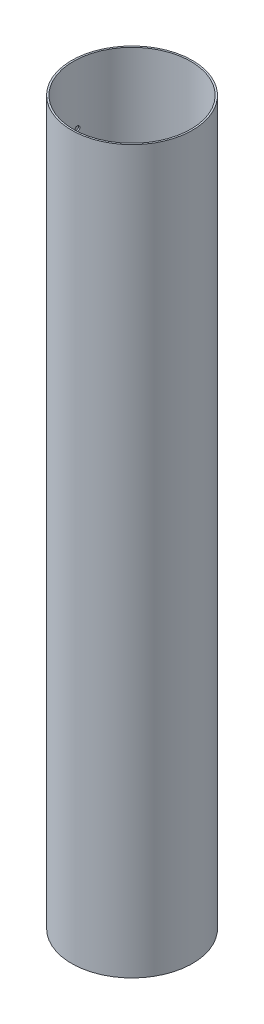
ISO-10303-21;
HEADER;
FILE_DESCRIPTION(('STEP AP214'),'2;1');
FILE_NAME('part.step','',(''),(''),'','','');
FILE_SCHEMA(('AUTOMOTIVE_DESIGN { 1 0 10303 214 1 1 1 1 }'));
ENDSEC;
DATA;
#1=APPLICATION_CONTEXT('core data for automotive mechanical design processes');
#2=APPLICATION_PROTOCOL_DEFINITION('international standard','automotive_design',2000,#1);
#3=PRODUCT_CONTEXT('',#1,'mechanical');
#4=PRODUCT('Part','Part','',(#3));
#5=PRODUCT_RELATED_PRODUCT_CATEGORY('part','',(#4));
#6=PRODUCT_DEFINITION_FORMATION('','',#4);
#7=PRODUCT_DEFINITION_CONTEXT('part definition',#1,'design');
#8=PRODUCT_DEFINITION('design','',#6,#7);
#9=PRODUCT_DEFINITION_SHAPE('','',#8);
#10=(LENGTH_UNIT() NAMED_UNIT(*) SI_UNIT(.MILLI.,.METRE.));
#11=(NAMED_UNIT(*) PLANE_ANGLE_UNIT() SI_UNIT($,.RADIAN.));
#12=(NAMED_UNIT(*) SI_UNIT($,.STERADIAN.) SOLID_ANGLE_UNIT());
#13=UNCERTAINTY_MEASURE_WITH_UNIT(LENGTH_MEASURE(1.E-05),#10,'distance_accuracy_value','');
#14=(GEOMETRIC_REPRESENTATION_CONTEXT(3) GLOBAL_UNCERTAINTY_ASSIGNED_CONTEXT((#13)) GLOBAL_UNIT_ASSIGNED_CONTEXT((#10,
#11,#12)) REPRESENTATION_CONTEXT('',''));
#15=CARTESIAN_POINT('',(0.,0.,0.));
#16=DIRECTION('',(0.,0.,1.));
#17=DIRECTION('',(1.,0.,0.));
#18=AXIS2_PLACEMENT_3D('',#15,#16,#17);
#19=CARTESIAN_POINT('',(0.,609.6,0.));
#20=DIRECTION('',(0.,1.,0.));
#21=DIRECTION('',(0.,0.,1.));
#22=AXIS2_PLACEMENT_3D('',#19,#20,#21);
#23=PLANE('',#22);
#24=CARTESIAN_POINT('',(0.,609.6,0.));
#25=DIRECTION('',(0.,1.,0.));
#26=DIRECTION('',(0.,0.,1.));
#27=AXIS2_PLACEMENT_3D('',#24,#25,#26);
#28=CIRCLE('',#27,51.054);
#29=CARTESIAN_POINT('',(0.,609.6,-51.054));
#30=VERTEX_POINT('',#29);
#31=EDGE_CURVE('E10',#30,#30,#28,.T.);
#32=ORIENTED_EDGE('',*,*,#31,.T.);
#33=EDGE_LOOP('',(#32));
#34=FACE_BOUND('',#33,.T.);
#35=CARTESIAN_POINT('',(0.,609.6,0.));
#36=DIRECTION('',(0.,1.,0.));
#37=DIRECTION('',(0.,0.,1.));
#38=AXIS2_PLACEMENT_3D('',#35,#36,#37);
#39=CIRCLE('',#38,49.657);
#40=CARTESIAN_POINT('',(0.,609.6,49.657));
#41=VERTEX_POINT('',#40);
#42=EDGE_CURVE('E49',#41,#41,#39,.T.);
#43=ORIENTED_EDGE('',*,*,#42,.F.);
#44=EDGE_LOOP('',(#43));
#45=FACE_BOUND('',#44,.T.);
#46=ADVANCED_FACE('F31',(#34,#45),#23,.T.);
#47=CARTESIAN_POINT('',(0.,0.,0.));
#48=DIRECTION('',(0.,1.,0.));
#49=DIRECTION('',(0.,0.,1.));
#50=AXIS2_PLACEMENT_3D('',#47,#48,#49);
#51=PLANE('',#50);
#52=CARTESIAN_POINT('',(0.,0.,0.));
#53=DIRECTION('',(0.,1.,0.));
#54=DIRECTION('',(0.,0.,1.));
#55=AXIS2_PLACEMENT_3D('',#52,#53,#54);
#56=CIRCLE('',#55,51.054);
#57=CARTESIAN_POINT('',(0.,0.,-51.054));
#58=VERTEX_POINT('',#57);
#59=EDGE_CURVE('E44',#58,#58,#56,.T.);
#60=ORIENTED_EDGE('',*,*,#59,.F.);
#61=EDGE_LOOP('',(#60));
#62=FACE_BOUND('',#61,.T.);
#63=CARTESIAN_POINT('',(0.,0.,0.));
#64=DIRECTION('',(0.,1.,0.));
#65=DIRECTION('',(0.,0.,1.));
#66=AXIS2_PLACEMENT_3D('',#63,#64,#65);
#67=CIRCLE('',#66,49.657);
#68=CARTESIAN_POINT('',(0.,0.,49.657));
#69=VERTEX_POINT('',#68);
#70=EDGE_CURVE('E52',#69,#69,#67,.T.);
#71=ORIENTED_EDGE('',*,*,#70,.T.);
#72=EDGE_LOOP('',(#71));
#73=FACE_BOUND('',#72,.T.);
#74=ADVANCED_FACE('F122',(#62,#73),#51,.F.);
#75=CARTESIAN_POINT('',(0.,609.6,0.));
#76=DIRECTION('',(0.,-1.,0.));
#77=DIRECTION('',(0.,0.,-1.));
#78=AXIS2_PLACEMENT_3D('',#75,#76,#77);
#79=CYLINDRICAL_SURFACE('',#78,51.054);
#80=CARTESIAN_POINT('',(0.,609.6,-51.054));
#81=CARTESIAN_POINT('',(0.,603.25,-51.054));
#82=CARTESIAN_POINT('',(0.,596.9,-51.054));
#83=CARTESIAN_POINT('',(0.,584.2,-51.054));
#84=CARTESIAN_POINT('',(0.,577.85,-51.054));
#85=CARTESIAN_POINT('',(0.,565.15,-51.054));
#86=CARTESIAN_POINT('',(0.,558.8,-51.054));
#87=CARTESIAN_POINT('',(0.,546.1,-51.054));
#88=CARTESIAN_POINT('',(0.,539.75,-51.054));
#89=CARTESIAN_POINT('',(0.,527.05,-51.054));
#90=CARTESIAN_POINT('',(0.,520.7,-51.054));
#91=CARTESIAN_POINT('',(0.,508.,-51.054));
#92=CARTESIAN_POINT('',(0.,501.65,-51.054));
#93=CARTESIAN_POINT('',(0.,488.95,-51.054));
#94=CARTESIAN_POINT('',(0.,482.6,-51.054));
#95=CARTESIAN_POINT('',(0.,469.9,-51.054));
#96=CARTESIAN_POINT('',(0.,463.55,-51.054));
#97=CARTESIAN_POINT('',(0.,450.85,-51.054));
#98=CARTESIAN_POINT('',(0.,444.5,-51.054));
#99=CARTESIAN_POINT('',(0.,431.8,-51.054));
#100=CARTESIAN_POINT('',(0.,425.45,-51.054));
#101=CARTESIAN_POINT('',(0.,412.75,-51.054));
#102=CARTESIAN_POINT('',(0.,406.4,-51.054));
#103=CARTESIAN_POINT('',(0.,393.7,-51.054));
#104=CARTESIAN_POINT('',(0.,387.35,-51.054));
#105=CARTESIAN_POINT('',(0.,374.65,-51.054));
#106=CARTESIAN_POINT('',(0.,368.3,-51.054));
#107=CARTESIAN_POINT('',(0.,355.6,-51.054));
#108=CARTESIAN_POINT('',(0.,349.25,-51.054));
#109=CARTESIAN_POINT('',(0.,336.55,-51.054));
#110=CARTESIAN_POINT('',(0.,330.2,-51.054));
#111=CARTESIAN_POINT('',(0.,317.5,-51.054));
#112=CARTESIAN_POINT('',(0.,311.15,-51.054));
#113=CARTESIAN_POINT('',(0.,298.45,-51.054));
#114=CARTESIAN_POINT('',(0.,292.1,-51.054));
#115=CARTESIAN_POINT('',(0.,279.4,-51.054));
#116=CARTESIAN_POINT('',(0.,273.05,-51.054));
#117=CARTESIAN_POINT('',(0.,260.35,-51.054));
#118=CARTESIAN_POINT('',(0.,254.,-51.054));
#119=CARTESIAN_POINT('',(0.,241.3,-51.054));
#120=CARTESIAN_POINT('',(0.,234.95,-51.054));
#121=CARTESIAN_POINT('',(0.,222.25,-51.054));
#122=CARTESIAN_POINT('',(0.,215.9,-51.054));
#123=CARTESIAN_POINT('',(0.,203.2,-51.054));
#124=CARTESIAN_POINT('',(0.,196.85,-51.054));
#125=CARTESIAN_POINT('',(0.,184.15,-51.054));
#126=CARTESIAN_POINT('',(0.,177.8,-51.054));
#127=CARTESIAN_POINT('',(0.,165.1,-51.054));
#128=CARTESIAN_POINT('',(0.,158.75,-51.054));
#129=CARTESIAN_POINT('',(0.,146.05,-51.054));
#130=CARTESIAN_POINT('',(0.,139.7,-51.054));
#131=CARTESIAN_POINT('',(0.,127.,-51.054));
#132=CARTESIAN_POINT('',(0.,120.65,-51.054));
#133=CARTESIAN_POINT('',(0.,107.95,-51.054));
#134=CARTESIAN_POINT('',(0.,101.6,-51.054));
#135=CARTESIAN_POINT('',(0.,88.9,-51.054));
#136=CARTESIAN_POINT('',(0.,82.5500000000001,-51.054));
#137=CARTESIAN_POINT('',(0.,69.85,-51.054));
#138=CARTESIAN_POINT('',(0.,63.5,-51.054));
#139=CARTESIAN_POINT('',(0.,50.8,-51.054));
#140=CARTESIAN_POINT('',(0.,44.45,-51.054));
#141=CARTESIAN_POINT('',(0.,31.75,-51.054));
#142=CARTESIAN_POINT('',(0.,25.4,-51.054));
#143=CARTESIAN_POINT('',(0.,12.7,-51.054));
#144=CARTESIAN_POINT('',(0.,6.35000000000001,-51.054));
#145=CARTESIAN_POINT('',(0.,0.,-51.054));
#146=B_SPLINE_CURVE_WITH_KNOTS('',3,(#80,#81,#82,#83,#84,#85,#86,#87,#88,#89,#90,#91,#92,#93,
#94,#95,#96,#97,#98,#99,#100,#101,#102,#103,#104,#105,#106,#107,#108,#109,#110,#111,#112,#113,
#114,#115,#116,#117,#118,#119,#120,#121,#122,#123,#124,#125,#126,#127,#128,#129,#130,#131,#132,
#133,#134,#135,#136,#137,#138,#139,#140,#141,#142,#143,#144,#145),.UNSPECIFIED.,.F.,.F.,(4,2,2,
2,2,2,2,2,2,2,2,2,2,2,2,2,2,2,2,2,2,2,2,2,2,2,2,2,2,2,2,2,4),(0.,19.05,38.1,57.15,76.2,
95.2500000000001,114.3,133.35,152.4,171.45,190.5,209.55,228.6,247.65,266.7,285.75,304.8,323.85,
342.9,361.95,381.,400.05,419.1,438.15,457.2,476.25,495.3,514.35,533.4,552.45,571.5,590.55,
609.6),.UNSPECIFIED.);
#147=EDGE_CURVE('BSEAM33',#30,#58,#146,.T.);
#148=ORIENTED_EDGE('',*,*,#31,.F.);
#149=ORIENTED_EDGE('',*,*,#59,.T.);
#150=ORIENTED_EDGE('',*,*,#147,.T.);
#151=ORIENTED_EDGE('',*,*,#147,.F.);
#152=EDGE_LOOP('',(#148,#150,#149,#151));
#153=FACE_BOUND('',#152,.T.);
#154=ADVANCED_FACE('F33',(#153),#79,.T.);
#155=CARTESIAN_POINT('',(0.,609.6,0.));
#156=DIRECTION('',(0.,-1.,0.));
#157=DIRECTION('',(0.,0.,-1.));
#158=AXIS2_PLACEMENT_3D('',#155,#156,#157);
#159=CYLINDRICAL_SURFACE('',#158,49.657);
#160=CARTESIAN_POINT('',(-49.6375410768889,558.799999999999,-1.39002332360642));
#161=CARTESIAN_POINT('',(-49.6375412752808,558.688584541107,-1.39002827456291));
#162=CARTESIAN_POINT('',(-49.6372800864521,558.577089428201,-1.39944221167987));
#163=CARTESIAN_POINT('',(-49.6362107169438,558.357173112189,-1.43686168498933));
#164=CARTESIAN_POINT('',(-49.6354018867289,558.24875571872,-1.4648892973515));
#165=CARTESIAN_POINT('',(-49.6331675645323,558.038212492124,-1.53872770679509));
#166=CARTESIAN_POINT('',(-49.6317423797103,557.936083554076,-1.58452964489386));
#167=CARTESIAN_POINT('',(-49.628174293632,557.740990534164,-1.69259379031457));
#168=CARTESIAN_POINT('',(-49.626031565022,557.648024254657,-1.75485203737036));
#169=CARTESIAN_POINT('',(-49.6209117271885,557.473802392998,-1.89409892653568));
#170=CARTESIAN_POINT('',(-49.6179341151217,557.392553913177,-1.97109643708397));
#171=CARTESIAN_POINT('',(-49.6110392641001,557.244134247752,-2.13760629207425));
#172=CARTESIAN_POINT('',(-49.607121987335,557.176963628817,-2.22711914004843));
#173=CARTESIAN_POINT('',(-49.5982747710421,557.058590011849,-2.41613941459491));
#174=CARTESIAN_POINT('',(-49.5933445116871,557.00739206973,-2.51564999264897));
#175=CARTESIAN_POINT('',(-49.5824571198031,556.922449719674,-2.72180805050877));
#176=CARTESIAN_POINT('',(-49.5764999929816,556.888705214732,-2.82845549064474));
#177=CARTESIAN_POINT('',(-49.5636221424962,556.839645075582,-3.0457916077431));
#178=CARTESIAN_POINT('',(-49.5567019399869,556.82431951716,-3.15647807530233));
#179=CARTESIAN_POINT('',(-49.5420405757379,556.812501701443,-3.37879757321981));
#180=CARTESIAN_POINT('',(-49.5342994186619,556.816009337165,-3.49043059819747));
#181=CARTESIAN_POINT('',(-49.518232677838,556.841750049958,-3.71140814421401));
#182=CARTESIAN_POINT('',(-49.5099074303094,556.863972434047,-3.82075393554685));
#183=CARTESIAN_POINT('',(-49.4929786645921,556.926495271132,-4.03412613237941));
#184=CARTESIAN_POINT('',(-49.4843751455487,556.966795779655,-4.13815252153935));
#185=CARTESIAN_POINT('',(-49.4672587028364,557.064343120382,-4.33797600172043));
#186=CARTESIAN_POINT('',(-49.4587458060351,557.121594840844,-4.4337707086579));
#187=CARTESIAN_POINT('',(-49.4422211160267,557.251415844998,-4.61439694494032));
#188=CARTESIAN_POINT('',(-49.4342093250081,557.32398519558,-4.69922842640754));
#189=CARTESIAN_POINT('',(-49.4190958561769,557.482441972287,-4.85559500364809));
#190=CARTESIAN_POINT('',(-49.4119948186163,557.568338674703,-4.92712076134766));
#191=CARTESIAN_POINT('',(-49.3990983015834,557.750979206564,-5.0547864914637));
#192=CARTESIAN_POINT('',(-49.393302822375,557.847723038201,-5.11092646076852));
#193=CARTESIAN_POINT('',(-49.3833478921562,558.049317063777,-5.20623737528412));
#194=CARTESIAN_POINT('',(-49.379188472317,558.154167412122,-5.24540799718501));
#195=CARTESIAN_POINT('',(-49.3727499041062,558.36899569882,-5.30567075889867));
#196=CARTESIAN_POINT('',(-49.3704707466893,558.478973612503,-5.32676298568132));
#197=CARTESIAN_POINT('',(-49.3679295822729,558.700853681804,-5.35026358885499));
#198=CARTESIAN_POINT('',(-49.3676661811303,558.812754453836,-5.35268487850146));
#199=CARTESIAN_POINT('',(-49.3691686490426,559.035375374394,-5.338809111521));
#200=CARTESIAN_POINT('',(-49.3709345138496,559.146095525393,-5.32251209407678));
#201=CARTESIAN_POINT('',(-49.3763890811548,559.363175948312,-5.27166927250344));
#202=CARTESIAN_POINT('',(-49.3800771632525,559.469537615005,-5.23712935626799));
#203=CARTESIAN_POINT('',(-49.3891586599535,559.674924743175,-5.15077952453522));
#204=CARTESIAN_POINT('',(-49.3945520808011,559.773950177788,-5.09896954580163));
#205=CARTESIAN_POINT('',(-49.4067379857415,559.961913624639,-4.97950638922706));
#206=CARTESIAN_POINT('',(-49.413531237777,560.050846058184,-4.91184451228645));
#207=CARTESIAN_POINT('',(-49.4281388682249,560.216042966663,-4.76259845184708));
#208=CARTESIAN_POINT('',(-49.4359532509485,560.292307388111,-4.68101420956849));
#209=CARTESIAN_POINT('',(-49.4521968218406,560.430046854594,-4.50617095060989));
#210=CARTESIAN_POINT('',(-49.4606263546345,560.491513525305,-4.41290536841184));
#211=CARTESIAN_POINT('',(-49.4776825756014,560.597855440013,-4.21736820949609));
#212=CARTESIAN_POINT('',(-49.4863092631489,560.642730736632,-4.11509666134305));
#213=CARTESIAN_POINT('',(-49.5033725586181,560.714601378473,-3.90447245625387));
#214=CARTESIAN_POINT('',(-49.5118092231512,560.741602118775,-3.79612164494319));
#215=CARTESIAN_POINT('',(-49.5281664163602,560.776974875063,-3.57638276845185));
#216=CARTESIAN_POINT('',(-49.5360869465591,560.785346946018,-3.46499471223446));
#217=CARTESIAN_POINT('',(-49.5511530176797,560.783224103515,-3.24242448405444));
#218=CARTESIAN_POINT('',(-49.5582990955483,560.772742351759,-3.13124222266233));
#219=CARTESIAN_POINT('',(-49.5716551738684,560.733236545112,-2.91216431205837));
#220=CARTESIAN_POINT('',(-49.5778651725003,560.704212454175,-2.80426866923586));
#221=CARTESIAN_POINT('',(-49.589268160254,560.628448230434,-2.59482964103801));
#222=CARTESIAN_POINT('',(-49.5944611355877,560.581707857468,-2.49328634179656));
#223=CARTESIAN_POINT('',(-49.6038268809585,560.471840864151,-2.29944258775412));
#224=CARTESIAN_POINT('',(-49.6079996854453,560.408714797267,-2.20714182090984));
#225=CARTESIAN_POINT('',(-49.6153863322025,560.267823846911,-2.03435121959828));
#226=CARTESIAN_POINT('',(-49.6185996066481,560.190050339678,-1.95386839294063));
#227=CARTESIAN_POINT('',(-49.62416369298,560.022067549885,-1.8070528589926));
#228=CARTESIAN_POINT('',(-49.6265142917135,559.931855201458,-1.74072365051851));
#229=CARTESIAN_POINT('',(-49.6304684370906,559.741504793857,-1.624090697103));
#230=CARTESIAN_POINT('',(-49.6320713974024,559.641359018827,-1.57379953966747));
#231=CARTESIAN_POINT('',(-49.6346341004161,559.4341156253,-1.49080087022516));
#232=CARTESIAN_POINT('',(-49.6355946073117,559.327026432951,-1.45807247663408));
#233=CARTESIAN_POINT('',(-49.636701174005,559.149387964408,-1.41977064420261));
#234=CARTESIAN_POINT('',(-49.6370171130742,559.079990685379,-1.40862961816463));
#235=CARTESIAN_POINT('',(-49.6374370019419,558.940406150333,-1.39375439968871));
#236=CARTESIAN_POINT('',(-49.6375409518536,558.870218894738,-1.39002020329711));
#237=CARTESIAN_POINT('',(-49.6375410768889,558.799999999999,-1.39002332360642));
#238=B_SPLINE_CURVE_WITH_KNOTS('',3,(#160,#161,#162,#163,#164,#165,#166,#167,#168,#169,#170,
#171,#172,#173,#174,#175,#176,#177,#178,#179,#180,#181,#182,#183,#184,#185,#186,#187,#188,#189,
#190,#191,#192,#193,#194,#195,#196,#197,#198,#199,#200,#201,#202,#203,#204,#205,#206,#207,#208,
#209,#210,#211,#212,#213,#214,#215,#216,#217,#218,#219,#220,#221,#222,#223,#224,#225,#226,#227,
#228,#229,#230,#231,#232,#233,#234,#235,#236,#237),.UNSPECIFIED.,.T.,.F.,(4,2,2,2,2,2,2,2,2,2,2,
2,2,2,2,2,2,2,2,2,2,2,2,2,2,2,2,2,2,2,2,2,2,2,2,2,2,2,4),(0.,0.333990060855451,
0.668376949319771,1.00259738810289,1.33673746872561,1.67107923299574,2.0054344527811,
2.33989540058989,2.67435448947433,3.00863328936366,3.34291019035962,3.67699622618351,
4.01108328816983,4.34526678557229,4.67945174234532,5.01387035547107,5.34828903623006,
5.68271408824846,6.01713753143688,6.35132965881175,6.68552108662959,7.01960472005066,
7.35368957676991,7.68795820159072,8.02222823771928,8.35668700118874,8.69114470387769,
9.02550141106474,9.3598571316328,9.69397953173046,10.0281025813362,10.3622301604642,
10.696346455082,11.0306600809608,11.3650562546606,11.6997142378055,12.0339734363399,
12.2444686914803,12.4549638342616),.UNSPECIFIED.);
#239=CARTESIAN_POINT('',(-49.6375410768889,558.799999999999,-1.39002332360642));
#240=VERTEX_POINT('',#239);
#241=EDGE_CURVE('E35',#240,#240,#238,.T.);
#242=ORIENTED_EDGE('',*,*,#241,.F.);
#243=EDGE_LOOP('',(#242));
#244=FACE_BOUND('',#243,.T.);
#245=CARTESIAN_POINT('',(-1.39002332360704,558.799999999999,49.6375410768889));
#246=CARTESIAN_POINT('',(-1.39002827456353,558.688584541107,49.6375412752808));
#247=CARTESIAN_POINT('',(-1.39944221168049,558.577089428201,49.6372800864521));
#248=CARTESIAN_POINT('',(-1.43686168498995,558.357173112189,49.6362107169438));
#249=CARTESIAN_POINT('',(-1.46488929735212,558.24875571872,49.6354018867289));
#250=CARTESIAN_POINT('',(-1.53872770679572,558.038212492124,49.6331675645323));
#251=CARTESIAN_POINT('',(-1.58452964489449,557.936083554076,49.6317423797103));
#252=CARTESIAN_POINT('',(-1.6925937903152,557.740990534164,49.628174293632));
#253=CARTESIAN_POINT('',(-1.75485203737099,557.648024254657,49.626031565022));
#254=CARTESIAN_POINT('',(-1.89409892653631,557.473802392998,49.6209117271885));
#255=CARTESIAN_POINT('',(-1.9710964370846,557.392553913177,49.6179341151217));
#256=CARTESIAN_POINT('',(-2.13760629207488,557.244134247752,49.6110392641001));
#257=CARTESIAN_POINT('',(-2.22711914004906,557.176963628817,49.607121987335));
#258=CARTESIAN_POINT('',(-2.41613941459554,557.058590011849,49.598274771042));
#259=CARTESIAN_POINT('',(-2.5156499926496,557.00739206973,49.5933445116871));
#260=CARTESIAN_POINT('',(-2.7218080505094,556.922449719674,49.5824571198031));
#261=CARTESIAN_POINT('',(-2.82845549064537,556.888705214732,49.5764999929815));
#262=CARTESIAN_POINT('',(-3.04579160774373,556.839645075582,49.5636221424962));
#263=CARTESIAN_POINT('',(-3.15647807530297,556.82431951716,49.5567019399869));
#264=CARTESIAN_POINT('',(-3.37879757322045,556.812501701443,49.5420405757378));
#265=CARTESIAN_POINT('',(-3.4904305981981,556.816009337165,49.5342994186618));
#266=CARTESIAN_POINT('',(-3.71140814421464,556.841750049958,49.518232677838));
#267=CARTESIAN_POINT('',(-3.82075393554747,556.863972434047,49.5099074303093));
#268=CARTESIAN_POINT('',(-4.03412613238004,556.926495271132,49.492978664592));
#269=CARTESIAN_POINT('',(-4.13815252153997,556.966795779655,49.4843751455486));
#270=CARTESIAN_POINT('',(-4.33797600172106,557.064343120382,49.4672587028364));
#271=CARTESIAN_POINT('',(-4.43377070865852,557.121594840844,49.458745806035));
#272=CARTESIAN_POINT('',(-4.61439694494094,557.251415844998,49.4422211160266));
#273=CARTESIAN_POINT('',(-4.69922842640816,557.32398519558,49.434209325008));
#274=CARTESIAN_POINT('',(-4.85559500364871,557.482441972287,49.4190958561768));
#275=CARTESIAN_POINT('',(-4.92712076134828,557.568338674703,49.4119948186163));
#276=CARTESIAN_POINT('',(-5.05478649146432,557.750979206564,49.3990983015833));
#277=CARTESIAN_POINT('',(-5.11092646076914,557.847723038201,49.393302822375));
#278=CARTESIAN_POINT('',(-5.20623737528474,558.049317063777,49.3833478921561));
#279=CARTESIAN_POINT('',(-5.24540799718563,558.154167412122,49.3791884723169));
#280=CARTESIAN_POINT('',(-5.30567075889929,558.36899569882,49.3727499041061));
#281=CARTESIAN_POINT('',(-5.32676298568194,558.478973612503,49.3704707466892));
#282=CARTESIAN_POINT('',(-5.35026358885562,558.700853681804,49.3679295822728));
#283=CARTESIAN_POINT('',(-5.35268487850208,558.812754453836,49.3676661811303));
#284=CARTESIAN_POINT('',(-5.33880911152163,559.035375374394,49.3691686490425));
#285=CARTESIAN_POINT('',(-5.3225120940774,559.146095525393,49.3709345138495));
#286=CARTESIAN_POINT('',(-5.27166927250407,559.363175948312,49.3763890811547));
#287=CARTESIAN_POINT('',(-5.23712935626863,559.469537615005,49.3800771632524));
#288=CARTESIAN_POINT('',(-5.15077952453588,559.674924743175,49.3891586599534));
#289=CARTESIAN_POINT('',(-5.09896954580228,559.773950177788,49.394552080801));
#290=CARTESIAN_POINT('',(-4.97950638922768,559.961913624639,49.4067379857414));
#291=CARTESIAN_POINT('',(-4.91184451228707,560.050846058184,49.413531237777));
#292=CARTESIAN_POINT('',(-4.76259845184771,560.216042966663,49.4281388682249));
#293=CARTESIAN_POINT('',(-4.68101420956912,560.292307388111,49.4359532509484));
#294=CARTESIAN_POINT('',(-4.5061709506105,560.430046854594,49.4521968218405));
#295=CARTESIAN_POINT('',(-4.41290536841243,560.491513525304,49.4606263546344));
#296=CARTESIAN_POINT('',(-4.21736820949669,560.597855440013,49.4776825756013));
#297=CARTESIAN_POINT('',(-4.11509666134366,560.642730736632,49.4863092631488));
#298=CARTESIAN_POINT('',(-3.9044724562545,560.714601378473,49.5033725586181));
#299=CARTESIAN_POINT('',(-3.79612164494382,560.741602118775,49.5118092231511));
#300=CARTESIAN_POINT('',(-3.57638276845248,560.776974875063,49.5281664163602));
#301=CARTESIAN_POINT('',(-3.46499471223509,560.785346946018,49.5360869465591));
#302=CARTESIAN_POINT('',(-3.24242448405506,560.783224103515,49.5511530176797));
#303=CARTESIAN_POINT('',(-3.13124222266294,560.77274235176,49.5582990955483));
#304=CARTESIAN_POINT('',(-2.91216431205898,560.733236545112,49.5716551738684));
#305=CARTESIAN_POINT('',(-2.80426866923648,560.704212454175,49.5778651725002));
#306=CARTESIAN_POINT('',(-2.59482964103866,560.628448230434,49.589268160254));
#307=CARTESIAN_POINT('',(-2.49328634179722,560.581707857468,49.5944611355876));
#308=CARTESIAN_POINT('',(-2.29944258775478,560.471840864151,49.6038268809585));
#309=CARTESIAN_POINT('',(-2.20714182091047,560.408714797267,49.6079996854452));
#310=CARTESIAN_POINT('',(-2.0343512195989,560.267823846911,49.6153863322025));
#311=CARTESIAN_POINT('',(-1.95386839294125,560.190050339678,49.6185996066481));
#312=CARTESIAN_POINT('',(-1.80705285899322,560.022067549885,49.62416369298));
#313=CARTESIAN_POINT('',(-1.74072365051913,559.931855201458,49.6265142917135));
#314=CARTESIAN_POINT('',(-1.62409069710362,559.741504793857,49.6304684370906));
#315=CARTESIAN_POINT('',(-1.5737995396681,559.641359018827,49.6320713974024));
#316=CARTESIAN_POINT('',(-1.49080087022578,559.4341156253,49.634634100416));
#317=CARTESIAN_POINT('',(-1.4580724766347,559.327026432951,49.6355946073117));
#318=CARTESIAN_POINT('',(-1.41977064420324,559.149387964408,49.6367011740049));
#319=CARTESIAN_POINT('',(-1.40862961816526,559.079990685379,49.6370171130742));
#320=CARTESIAN_POINT('',(-1.39375439968933,558.940406150333,49.6374370019419));
#321=CARTESIAN_POINT('',(-1.39002020329774,558.870218894738,49.6375409518536));
#322=CARTESIAN_POINT('',(-1.39002332360704,558.799999999999,49.6375410768889));
#323=B_SPLINE_CURVE_WITH_KNOTS('',3,(#245,#246,#247,#248,#249,#250,#251,#252,#253,#254,#255,
#256,#257,#258,#259,#260,#261,#262,#263,#264,#265,#266,#267,#268,#269,#270,#271,#272,#273,#274,
#275,#276,#277,#278,#279,#280,#281,#282,#283,#284,#285,#286,#287,#288,#289,#290,#291,#292,#293,
#294,#295,#296,#297,#298,#299,#300,#301,#302,#303,#304,#305,#306,#307,#308,#309,#310,#311,#312,
#313,#314,#315,#316,#317,#318,#319,#320,#321,#322),.UNSPECIFIED.,.T.,.F.,(4,2,2,2,2,2,2,2,2,2,2,
2,2,2,2,2,2,2,2,2,2,2,2,2,2,2,2,2,2,2,2,2,2,2,2,2,2,2,4),(0.,0.333990060855451,
0.668376949319772,1.00259738810289,1.33673746872561,1.67107923299574,2.00543445278111,
2.3398954005899,2.67435448947434,3.00863328936367,3.34291019035962,3.6769962261835,
4.01108328816983,4.34526678557229,4.67945174234532,5.01387035547106,5.34828903623005,
5.68271408824846,6.01713753143687,6.35132965881174,6.68552108662958,7.01960472005054,
7.3536895767699,7.68795820159071,8.02222823771928,8.35668700118877,8.69114470387768,
9.02550141106473,9.35985713163279,9.69397953173045,10.0281025813362,10.3622301604641,
10.696346455082,11.0306600809608,11.3650562546606,11.6997142378055,12.0339734363399,
12.2444686914803,12.4549638342616),.UNSPECIFIED.);
#324=CARTESIAN_POINT('',(-1.39002332360704,558.799999999999,49.6375410768889));
#325=VERTEX_POINT('',#324);
#326=EDGE_CURVE('E94',#325,#325,#323,.T.);
#327=ORIENTED_EDGE('',*,*,#326,.F.);
#328=EDGE_LOOP('',(#327));
#329=FACE_BOUND('',#328,.T.);
#330=CARTESIAN_POINT('',(49.6375410768889,558.799999999999,1.39002332360628));
#331=CARTESIAN_POINT('',(49.6375412752808,558.688584541107,1.39002827456277));
#332=CARTESIAN_POINT('',(49.6372800864521,558.577089428201,1.39944221167973));
#333=CARTESIAN_POINT('',(49.6362107169438,558.357173112189,1.4368616849892));
#334=CARTESIAN_POINT('',(49.6354018867289,558.24875571872,1.46488929735137));
#335=CARTESIAN_POINT('',(49.6331675645323,558.038212492124,1.53872770679498));
#336=CARTESIAN_POINT('',(49.6317423797103,557.936083554076,1.58452964489376));
#337=CARTESIAN_POINT('',(49.628174293632,557.740990534164,1.69259379031448));
#338=CARTESIAN_POINT('',(49.626031565022,557.648024254657,1.75485203737026));
#339=CARTESIAN_POINT('',(49.6209117271885,557.473802392998,1.89409892653557));
#340=CARTESIAN_POINT('',(49.6179341151217,557.392553913177,1.97109643708386));
#341=CARTESIAN_POINT('',(49.6110392641001,557.244134247752,2.13760629207413));
#342=CARTESIAN_POINT('',(49.607121987335,557.176963628817,2.22711914004832));
#343=CARTESIAN_POINT('',(49.5982747710421,557.058590011849,2.4161394145948));
#344=CARTESIAN_POINT('',(49.5933445116871,557.00739206973,2.51564999264886));
#345=CARTESIAN_POINT('',(49.5824571198031,556.922449719674,2.72180805050866));
#346=CARTESIAN_POINT('',(49.5764999929816,556.888705214732,2.82845549064463));
#347=CARTESIAN_POINT('',(49.5636221424962,556.839645075582,3.04579160774299));
#348=CARTESIAN_POINT('',(49.5567019399869,556.82431951716,3.15647807530223));
#349=CARTESIAN_POINT('',(49.5420405757379,556.812501701443,3.37879757321971));
#350=CARTESIAN_POINT('',(49.5342994186619,556.816009337165,3.49043059819736));
#351=CARTESIAN_POINT('',(49.518232677838,556.841750049958,3.7114081442139));
#352=CARTESIAN_POINT('',(49.5099074303094,556.863972434047,3.82075393554673));
#353=CARTESIAN_POINT('',(49.4929786645921,556.926495271132,4.03412613237929));
#354=CARTESIAN_POINT('',(49.4843751455487,556.966795779655,4.13815252153922));
#355=CARTESIAN_POINT('',(49.4672587028364,557.064343120382,4.33797600172031));
#356=CARTESIAN_POINT('',(49.4587458060351,557.121594840844,4.43377070865777));
#357=CARTESIAN_POINT('',(49.4422211160267,557.251415844998,4.61439694494018));
#358=CARTESIAN_POINT('',(49.4342093250081,557.32398519558,4.6992284264074));
#359=CARTESIAN_POINT('',(49.4190958561769,557.482441972287,4.85559500364795));
#360=CARTESIAN_POINT('',(49.4119948186163,557.568338674703,4.92712076134752));
#361=CARTESIAN_POINT('',(49.3990983015834,557.750979206564,5.05478649146356));
#362=CARTESIAN_POINT('',(49.3933028223751,557.847723038201,5.11092646076838));
#363=CARTESIAN_POINT('',(49.3833478921562,558.049317063777,5.20623737528398));
#364=CARTESIAN_POINT('',(49.379188472317,558.154167412122,5.24540799718487));
#365=CARTESIAN_POINT('',(49.3727499041062,558.36899569882,5.30567075889855));
#366=CARTESIAN_POINT('',(49.3704707466893,558.478973612503,5.3267629856812));
#367=CARTESIAN_POINT('',(49.3679295822729,558.700853681804,5.35026358885487));
#368=CARTESIAN_POINT('',(49.3676661811304,558.812754453836,5.35268487850133));
#369=CARTESIAN_POINT('',(49.3691686490426,559.035375374395,5.33880911152085));
#370=CARTESIAN_POINT('',(49.3709345138496,559.146095525393,5.32251209407662));
#371=CARTESIAN_POINT('',(49.3763890811548,559.363175948312,5.27166927250329));
#372=CARTESIAN_POINT('',(49.3800771632525,559.469537615005,5.23712935626786));
#373=CARTESIAN_POINT('',(49.3891586599535,559.674924743175,5.15077952453513));
#374=CARTESIAN_POINT('',(49.3945520808011,559.773950177788,5.09896954580153));
#375=CARTESIAN_POINT('',(49.4067379857415,559.961913624639,4.97950638922694));
#376=CARTESIAN_POINT('',(49.413531237777,560.050846058184,4.91184451228633));
#377=CARTESIAN_POINT('',(49.4281388682249,560.216042966663,4.76259845184697));
#378=CARTESIAN_POINT('',(49.4359532509485,560.292307388111,4.68101420956838));
#379=CARTESIAN_POINT('',(49.4521968218406,560.430046854594,4.50617095060976));
#380=CARTESIAN_POINT('',(49.4606263546345,560.491513525304,4.41290536841169));
#381=CARTESIAN_POINT('',(49.4776825756014,560.597855440013,4.21736820949594));
#382=CARTESIAN_POINT('',(49.4863092631489,560.642730736632,4.11509666134292));
#383=CARTESIAN_POINT('',(49.5033725586181,560.714601378473,3.90447245625376));
#384=CARTESIAN_POINT('',(49.5118092231512,560.741602118775,3.79612164494307));
#385=CARTESIAN_POINT('',(49.5281664163602,560.776974875063,3.57638276845173));
#386=CARTESIAN_POINT('',(49.5360869465591,560.785346946018,3.46499471223433));
#387=CARTESIAN_POINT('',(49.5511530176797,560.783224103515,3.2424244840543));
#388=CARTESIAN_POINT('',(49.5582990955483,560.77274235176,3.13124222266218));
#389=CARTESIAN_POINT('',(49.5716551738684,560.733236545112,2.91216431205822));
#390=CARTESIAN_POINT('',(49.5778651725003,560.704212454175,2.80426866923572));
#391=CARTESIAN_POINT('',(49.589268160254,560.628448230434,2.59482964103787));
#392=CARTESIAN_POINT('',(49.5944611355877,560.581707857468,2.49328634179641));
#393=CARTESIAN_POINT('',(49.6038268809585,560.471840864151,2.29944258775396));
#394=CARTESIAN_POINT('',(49.6079996854453,560.408714797267,2.20714182090968));
#395=CARTESIAN_POINT('',(49.6153863322025,560.267823846911,2.03435121959812));
#396=CARTESIAN_POINT('',(49.6185996066481,560.190050339678,1.95386839294047));
#397=CARTESIAN_POINT('',(49.62416369298,560.022067549885,1.80705285899245));
#398=CARTESIAN_POINT('',(49.6265142917135,559.931855201458,1.74072365051837));
#399=CARTESIAN_POINT('',(49.6304684370906,559.741504793857,1.62409069710286));
#400=CARTESIAN_POINT('',(49.6320713974024,559.641359018827,1.57379953966733));
#401=CARTESIAN_POINT('',(49.6346341004161,559.4341156253,1.49080087022502));
#402=CARTESIAN_POINT('',(49.6355946073117,559.327026432951,1.45807247663394));
#403=CARTESIAN_POINT('',(49.636701174005,559.149387964408,1.41977064420248));
#404=CARTESIAN_POINT('',(49.6370171130742,559.079990685379,1.4086296181645));
#405=CARTESIAN_POINT('',(49.637437001942,558.940406150333,1.39375439968857));
#406=CARTESIAN_POINT('',(49.6375409518536,558.870218894738,1.39002020329698));
#407=CARTESIAN_POINT('',(49.6375410768889,558.799999999999,1.39002332360628));
#408=B_SPLINE_CURVE_WITH_KNOTS('',3,(#330,#331,#332,#333,#334,#335,#336,#337,#338,#339,#340,
#341,#342,#343,#344,#345,#346,#347,#348,#349,#350,#351,#352,#353,#354,#355,#356,#357,#358,#359,
#360,#361,#362,#363,#364,#365,#366,#367,#368,#369,#370,#371,#372,#373,#374,#375,#376,#377,#378,
#379,#380,#381,#382,#383,#384,#385,#386,#387,#388,#389,#390,#391,#392,#393,#394,#395,#396,#397,
#398,#399,#400,#401,#402,#403,#404,#405,#406,#407),.UNSPECIFIED.,.T.,.F.,(4,2,2,2,2,2,2,2,2,2,2,
2,2,2,2,2,2,2,2,2,2,2,2,2,2,2,2,2,2,2,2,2,2,2,2,2,2,2,4),(0.,0.333990060855451,
0.668376949319772,1.00259738810301,1.33673746872561,1.67107923299575,2.00543445278112,
2.33989540058991,2.67435448947435,3.00863328936368,3.34291019035964,3.67699622618351,
4.01108328816983,4.34526678557228,4.67945174234531,5.01387035547105,5.34828903623005,
5.68271408824845,6.01713753143698,6.35132965881196,6.68552108662969,7.01960472005053,
7.35368957676989,7.6879582015907,8.02222823771926,8.35668700118876,8.69114470387767,
9.02550141106472,9.35985713163279,9.69397953173045,10.0281025813363,10.3622301604642,
10.696346455082,11.0306600809609,11.3650562546606,11.6997142378055,12.0339734363399,
12.2444686914803,12.4549638342616),.UNSPECIFIED.);
#409=CARTESIAN_POINT('',(49.6375410768889,558.799999999999,1.39002332360628));
#410=VERTEX_POINT('',#409);
#411=EDGE_CURVE('E63',#410,#410,#408,.T.);
#412=ORIENTED_EDGE('',*,*,#411,.F.);
#413=EDGE_LOOP('',(#412));
#414=FACE_BOUND('',#413,.T.);
#415=CARTESIAN_POINT('',(1.39002332360635,558.799999999999,-49.6375410768889));
#416=CARTESIAN_POINT('',(1.39002827456284,558.688584541107,-49.6375412752808));
#417=CARTESIAN_POINT('',(1.3994422116798,558.577089428201,-49.6372800864521));
#418=CARTESIAN_POINT('',(1.43686168498926,558.357173112189,-49.6362107169438));
#419=CARTESIAN_POINT('',(1.46488929735144,558.24875571872,-49.6354018867289));
#420=CARTESIAN_POINT('',(1.53872770679503,558.038212492124,-49.6331675645323));
#421=CARTESIAN_POINT('',(1.58452964489381,557.936083554076,-49.6317423797103));
#422=CARTESIAN_POINT('',(1.69259379031451,557.740990534164,-49.628174293632));
#423=CARTESIAN_POINT('',(1.7548520373703,557.648024254657,-49.626031565022));
#424=CARTESIAN_POINT('',(1.89409892653563,557.473802392998,-49.6209117271885));
#425=CARTESIAN_POINT('',(1.97109643708392,557.392553913177,-49.6179341151217));
#426=CARTESIAN_POINT('',(2.1376062920742,557.244134247752,-49.6110392641001));
#427=CARTESIAN_POINT('',(2.22711914004838,557.176963628817,-49.607121987335));
#428=CARTESIAN_POINT('',(2.41613941459486,557.058590011849,-49.5982747710421));
#429=CARTESIAN_POINT('',(2.51564999264892,557.00739206973,-49.5933445116871));
#430=CARTESIAN_POINT('',(2.72180805050872,556.922449719674,-49.5824571198031));
#431=CARTESIAN_POINT('',(2.82845549064469,556.888705214732,-49.5764999929816));
#432=CARTESIAN_POINT('',(3.04579160774305,556.839645075582,-49.5636221424962));
#433=CARTESIAN_POINT('',(3.15647807530229,556.82431951716,-49.5567019399869));
#434=CARTESIAN_POINT('',(3.37879757321977,556.812501701443,-49.5420405757379));
#435=CARTESIAN_POINT('',(3.49043059819742,556.816009337165,-49.5342994186619));
#436=CARTESIAN_POINT('',(3.71140814421396,556.841750049958,-49.518232677838));
#437=CARTESIAN_POINT('',(3.82075393554679,556.863972434047,-49.5099074303094));
#438=CARTESIAN_POINT('',(4.03412613237936,556.926495271132,-49.4929786645921));
#439=CARTESIAN_POINT('',(4.13815252153929,556.966795779655,-49.4843751455487));
#440=CARTESIAN_POINT('',(4.33797600172037,557.064343120382,-49.4672587028364));
#441=CARTESIAN_POINT('',(4.43377070865784,557.121594840844,-49.4587458060351));
#442=CARTESIAN_POINT('',(4.61439694494026,557.251415844998,-49.4422211160267));
#443=CARTESIAN_POINT('',(4.69922842640747,557.32398519558,-49.4342093250081));
#444=CARTESIAN_POINT('',(4.85559500364802,557.482441972287,-49.4190958561769));
#445=CARTESIAN_POINT('',(4.92712076134759,557.568338674703,-49.4119948186163));
#446=CARTESIAN_POINT('',(5.05478649146363,557.750979206564,-49.3990983015834));
#447=CARTESIAN_POINT('',(5.11092646076845,557.847723038201,-49.3933028223751));
#448=CARTESIAN_POINT('',(5.20623737528406,558.049317063777,-49.3833478921562));
#449=CARTESIAN_POINT('',(5.24540799718494,558.154167412122,-49.379188472317));
#450=CARTESIAN_POINT('',(5.30567075889861,558.36899569882,-49.3727499041062));
#451=CARTESIAN_POINT('',(5.32676298568125,558.478973612503,-49.3704707466893));
#452=CARTESIAN_POINT('',(5.35026358885493,558.700853681804,-49.3679295822729));
#453=CARTESIAN_POINT('',(5.3526848785014,558.812754453836,-49.3676661811303));
#454=CARTESIAN_POINT('',(5.33880911152094,559.035375374394,-49.3691686490426));
#455=CARTESIAN_POINT('',(5.32251209407671,559.146095525393,-49.3709345138496));
#456=CARTESIAN_POINT('',(5.27166927250338,559.363175948312,-49.3763890811548));
#457=CARTESIAN_POINT('',(5.23712935626793,559.469537615005,-49.3800771632525));
#458=CARTESIAN_POINT('',(5.15077952453516,559.674924743175,-49.3891586599535));
#459=CARTESIAN_POINT('',(5.09896954580157,559.773950177788,-49.3945520808011));
#460=CARTESIAN_POINT('',(4.979506389227,559.961913624639,-49.4067379857415));
#461=CARTESIAN_POINT('',(4.91184451228639,560.050846058184,-49.413531237777));
#462=CARTESIAN_POINT('',(4.76259845184703,560.216042966663,-49.4281388682249));
#463=CARTESIAN_POINT('',(4.68101420956844,560.292307388111,-49.4359532509485));
#464=CARTESIAN_POINT('',(4.50617095060982,560.430046854594,-49.4521968218406));
#465=CARTESIAN_POINT('',(4.41290536841175,560.491513525304,-49.4606263546345));
#466=CARTESIAN_POINT('',(4.217368209496,560.597855440013,-49.4776825756014));
#467=CARTESIAN_POINT('',(4.11509666134298,560.642730736632,-49.4863092631489));
#468=CARTESIAN_POINT('',(3.90447245625382,560.714601378473,-49.5033725586181));
#469=CARTESIAN_POINT('',(3.79612164494314,560.741602118775,-49.5118092231512));
#470=CARTESIAN_POINT('',(3.5763827684518,560.776974875063,-49.5281664163602));
#471=CARTESIAN_POINT('',(3.4649947122344,560.785346946018,-49.5360869465591));
#472=CARTESIAN_POINT('',(3.24242448405437,560.783224103515,-49.5511530176797));
#473=CARTESIAN_POINT('',(3.13124222266225,560.77274235176,-49.5582990955483));
#474=CARTESIAN_POINT('',(2.91216431205829,560.733236545112,-49.5716551738684));
#475=CARTESIAN_POINT('',(2.80426866923579,560.704212454175,-49.5778651725003));
#476=CARTESIAN_POINT('',(2.59482964103795,560.628448230434,-49.589268160254));
#477=CARTESIAN_POINT('',(2.49328634179649,560.581707857468,-49.5944611355877));
#478=CARTESIAN_POINT('',(2.29944258775405,560.471840864151,-49.6038268809585));
#479=CARTESIAN_POINT('',(2.20714182090977,560.408714797267,-49.6079996854453));
#480=CARTESIAN_POINT('',(2.03435121959821,560.267823846911,-49.6153863322025));
#481=CARTESIAN_POINT('',(1.95386839294055,560.190050339678,-49.6185996066481));
#482=CARTESIAN_POINT('',(1.80705285899253,560.022067549885,-49.62416369298));
#483=CARTESIAN_POINT('',(1.74072365051844,559.931855201458,-49.6265142917135));
#484=CARTESIAN_POINT('',(1.62409069710293,559.741504793857,-49.6304684370906));
#485=CARTESIAN_POINT('',(1.5737995396674,559.641359018827,-49.6320713974024));
#486=CARTESIAN_POINT('',(1.49080087022509,559.4341156253,-49.634634100416));
#487=CARTESIAN_POINT('',(1.45807247663401,559.327026432951,-49.6355946073117));
#488=CARTESIAN_POINT('',(1.41977064420255,559.149387964408,-49.636701174005));
#489=CARTESIAN_POINT('',(1.40862961816457,559.079990685379,-49.6370171130742));
#490=CARTESIAN_POINT('',(1.39375439968864,558.940406150333,-49.637437001942));
#491=CARTESIAN_POINT('',(1.39002020329705,558.870218894738,-49.6375409518536));
#492=CARTESIAN_POINT('',(1.39002332360635,558.799999999999,-49.6375410768889));
#493=B_SPLINE_CURVE_WITH_KNOTS('',3,(#415,#416,#417,#418,#419,#420,#421,#422,#423,#424,#425,
#426,#427,#428,#429,#430,#431,#432,#433,#434,#435,#436,#437,#438,#439,#440,#441,#442,#443,#444,
#445,#446,#447,#448,#449,#450,#451,#452,#453,#454,#455,#456,#457,#458,#459,#460,#461,#462,#463,
#464,#465,#466,#467,#468,#469,#470,#471,#472,#473,#474,#475,#476,#477,#478,#479,#480,#481,#482,
#483,#484,#485,#486,#487,#488,#489,#490,#491,#492),.UNSPECIFIED.,.T.,.F.,(4,2,2,2,2,2,2,2,2,2,2,
2,2,2,2,2,2,2,2,2,2,2,2,2,2,2,2,2,2,2,2,2,2,2,2,2,2,2,4),(0.,0.333990060855451,
0.668376949319772,1.00259738810289,1.33673746872561,1.67107923299575,2.00543445278111,
2.3398954005899,2.67435448947434,3.00863328936367,3.34291019035963,3.67699622618351,
4.01108328816983,4.34526678557228,4.67945174234531,5.01387035547106,5.34828903623005,
5.68271408824845,6.01713753143687,6.35132965881174,6.68552108662958,7.01960472005065,
7.3536895767699,7.68795820159071,8.02222823771927,8.35668700118877,8.69114470387767,
9.02550141106472,9.35985713163279,9.69397953173045,10.0281025813362,10.3622301604642,
10.696346455082,11.0306600809608,11.3650562546606,11.6997142378055,12.0339734363399,
12.2444686914803,12.4549638342616),.UNSPECIFIED.);
#494=CARTESIAN_POINT('',(1.39002332360635,558.799999999999,-49.6375410768889));
#495=VERTEX_POINT('',#494);
#496=EDGE_CURVE('E55',#495,#495,#493,.T.);
#497=ORIENTED_EDGE('',*,*,#496,.F.);
#498=EDGE_LOOP('',(#497));
#499=FACE_BOUND('',#498,.T.);
#500=ORIENTED_EDGE('',*,*,#42,.T.);
#501=EDGE_LOOP('',(#500));
#502=FACE_BOUND('',#501,.T.);
#503=ORIENTED_EDGE('',*,*,#70,.F.);
#504=EDGE_LOOP('',(#503));
#505=FACE_BOUND('',#504,.T.);
#506=ADVANCED_FACE('F68',(#244,#329,#414,#499,#502,#505),#159,.F.);
#507=CARTESIAN_POINT('',(2.58760387448326,558.799999999999,-38.0120284408602));
#508=DIRECTION('',(0.067916112191174,0.,-0.997691035193178));
#509=DIRECTION('',(-0.997691035193178,0.,-0.067916112191174));
#510=AXIS2_PLACEMENT_3D('',#507,#508,#509);
#511=CYLINDRICAL_SURFACE('',#510,1.98437500000003);
#512=ORIENTED_EDGE('',*,*,#496,.T.);
#513=EDGE_LOOP('',(#512));
#514=FACE_BOUND('',#513,.T.);
#515=CARTESIAN_POINT('',(3.45013849931117,558.799999999999,-50.6827045878136));
#516=DIRECTION('',(0.067916112191174,0.,-0.997691035193178));
#517=DIRECTION('',(-0.997691035193178,0.,-0.067916112191174));
#518=AXIS2_PLACEMENT_3D('',#515,#516,#517);
#519=CIRCLE('',#518,1.98437500000003);
#520=CARTESIAN_POINT('',(1.47034535134967,558.799999999999,-50.8174756229429));
#521=VERTEX_POINT('',#520);
#522=EDGE_CURVE('E62',#521,#521,#519,.T.);
#523=ORIENTED_EDGE('',*,*,#522,.T.);
#524=EDGE_LOOP('',(#523));
#525=FACE_BOUND('',#524,.T.);
#526=ADVANCED_FACE('F71',(#514,#525),#511,.F.);
#527=CARTESIAN_POINT('',(3.45013849931117,558.799999999999,-50.6827045878136));
#528=DIRECTION('',(0.067916112191174,0.,-0.997691035193178));
#529=DIRECTION('',(-0.997691035193178,0.,-0.067916112191174));
#530=AXIS2_PLACEMENT_3D('',#527,#528,#529);
#531=PLANE('',#530);
#532=ORIENTED_EDGE('',*,*,#522,.F.);
#533=EDGE_LOOP('',(#532));
#534=FACE_BOUND('',#533,.T.);
#535=ADVANCED_FACE('F75',(#534),#531,.F.);
#536=CARTESIAN_POINT('',(38.01202844086,558.799999999999,2.58760387448329));
#537=DIRECTION('',(0.997691035193179,0.,0.0679161121911635));
#538=DIRECTION('',(0.0679161121911635,0.,-0.997691035193179));
#539=AXIS2_PLACEMENT_3D('',#536,#537,#538);
#540=CYLINDRICAL_SURFACE('',#539,1.98437500000003);
#541=ORIENTED_EDGE('',*,*,#411,.T.);
#542=EDGE_LOOP('',(#541));
#543=FACE_BOUND('',#542,.T.);
#544=CARTESIAN_POINT('',(50.6827045878133,558.799999999999,3.45013849931107));
#545=DIRECTION('',(0.997691035193179,0.,0.0679161121911635));
#546=DIRECTION('',(0.0679161121911635,0.,-0.997691035193179));
#547=AXIS2_PLACEMENT_3D('',#544,#545,#546);
#548=CIRCLE('',#547,1.98437500000003);
#549=CARTESIAN_POINT('',(50.8174756229427,558.799999999999,1.47034535134957));
#550=VERTEX_POINT('',#549);
#551=EDGE_CURVE('E110',#550,#550,#548,.T.);
#552=ORIENTED_EDGE('',*,*,#551,.T.);
#553=EDGE_LOOP('',(#552));
#554=FACE_BOUND('',#553,.T.);
#555=ADVANCED_FACE('F78',(#543,#554),#540,.F.);
#556=CARTESIAN_POINT('',(50.6827045878133,558.799999999999,3.45013849931107));
#557=DIRECTION('',(0.997691035193179,0.,0.0679161121911635));
#558=DIRECTION('',(0.0679161121911635,0.,-0.997691035193179));
#559=AXIS2_PLACEMENT_3D('',#556,#557,#558);
#560=PLANE('',#559);
#561=ORIENTED_EDGE('',*,*,#551,.F.);
#562=EDGE_LOOP('',(#561));
#563=FACE_BOUND('',#562,.T.);
#564=ADVANCED_FACE('F83',(#563),#560,.F.);
#565=CARTESIAN_POINT('',(-2.58760387448396,558.799999999999,38.0120284408603));
#566=DIRECTION('',(-0.067916112191174,0.,0.997691035193178));
#567=DIRECTION('',(0.997691035193178,0.,0.067916112191174));
#568=AXIS2_PLACEMENT_3D('',#565,#566,#567);
#569=CYLINDRICAL_SURFACE('',#568,1.98437500000003);
#570=ORIENTED_EDGE('',*,*,#326,.T.);
#571=EDGE_LOOP('',(#570));
#572=FACE_BOUND('',#571,.T.);
#573=CARTESIAN_POINT('',(-3.45013849931187,558.799999999999,50.6827045878137));
#574=DIRECTION('',(-0.067916112191174,0.,0.997691035193178));
#575=DIRECTION('',(0.997691035193178,0.,0.067916112191174));
#576=AXIS2_PLACEMENT_3D('',#573,#574,#575);
#577=CIRCLE('',#576,1.98437500000003);
#578=CARTESIAN_POINT('',(-1.47034535135037,558.799999999999,50.8174756229431));
#579=VERTEX_POINT('',#578);
#580=EDGE_CURVE('E105',#579,#579,#577,.T.);
#581=ORIENTED_EDGE('',*,*,#580,.T.);
#582=EDGE_LOOP('',(#581));
#583=FACE_BOUND('',#582,.T.);
#584=ADVANCED_FACE('F87',(#572,#583),#569,.F.);
#585=CARTESIAN_POINT('',(-3.45013849931187,558.799999999999,50.6827045878137));
#586=DIRECTION('',(-0.067916112191174,0.,0.997691035193178));
#587=DIRECTION('',(0.997691035193178,0.,0.067916112191174));
#588=AXIS2_PLACEMENT_3D('',#585,#586,#587);
#589=PLANE('',#588);
#590=ORIENTED_EDGE('',*,*,#580,.F.);
#591=EDGE_LOOP('',(#590));
#592=FACE_BOUND('',#591,.T.);
#593=ADVANCED_FACE('F92',(#592),#589,.F.);
#594=CARTESIAN_POINT('',(-38.0120284408606,558.799999999999,-2.58760387448339));
#595=DIRECTION('',(-0.997691035193179,0.,-0.0679161121911705));
#596=DIRECTION('',(-0.0679161121911705,0.,0.997691035193179));
#597=AXIS2_PLACEMENT_3D('',#594,#595,#596);
#598=CYLINDRICAL_SURFACE('',#597,1.98437500000003);
#599=ORIENTED_EDGE('',*,*,#241,.T.);
#600=EDGE_LOOP('',(#599));
#601=FACE_BOUND('',#600,.T.);
#602=CARTESIAN_POINT('',(-50.682704587814,558.799999999999,-3.45013849931126));
#603=DIRECTION('',(-0.997691035193179,0.,-0.0679161121911705));
#604=DIRECTION('',(-0.0679161121911705,0.,0.997691035193179));
#605=AXIS2_PLACEMENT_3D('',#602,#603,#604);
#606=CIRCLE('',#605,1.98437500000003);
#607=CARTESIAN_POINT('',(-50.8174756229434,558.799999999999,-1.47034535134976));
#608=VERTEX_POINT('',#607);
#609=EDGE_CURVE('E102',#608,#608,#606,.T.);
#610=ORIENTED_EDGE('',*,*,#609,.T.);
#611=EDGE_LOOP('',(#610));
#612=FACE_BOUND('',#611,.T.);
#613=ADVANCED_FACE('F189',(#601,#612),#598,.F.);
#614=CARTESIAN_POINT('',(-50.682704587814,558.799999999999,-3.45013849931126));
#615=DIRECTION('',(-0.997691035193179,0.,-0.0679161121911705));
#616=DIRECTION('',(-0.0679161121911705,0.,0.997691035193179));
#617=AXIS2_PLACEMENT_3D('',#614,#615,#616);
#618=PLANE('',#617);
#619=ORIENTED_EDGE('',*,*,#609,.F.);
#620=EDGE_LOOP('',(#619));
#621=FACE_BOUND('',#620,.T.);
#622=ADVANCED_FACE('F198',(#621),#618,.F.);
#623=CLOSED_SHELL('',(#46,#74,#154,#506,#526,#535,#555,#564,#584,#593,#613,#622));
#624=MANIFOLD_SOLID_BREP('B2',#623);
#625=ADVANCED_BREP_SHAPE_REPRESENTATION('',(#18,#624),#14);
#626=SHAPE_DEFINITION_REPRESENTATION(#9,#625);
ENDSEC;
END-ISO-10303-21;
